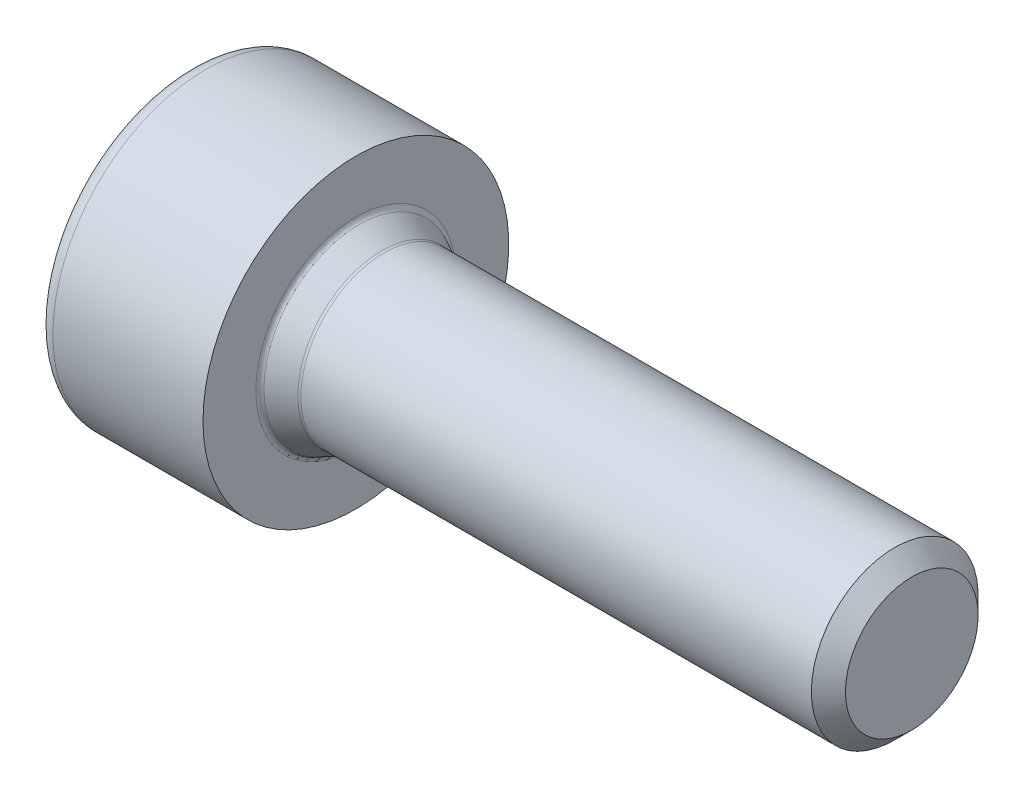
ISO-10303-21;
HEADER;
FILE_DESCRIPTION(('STEP AP214'),'2;1');
FILE_NAME('part.step','',(''),(''),'','','');
FILE_SCHEMA(('AUTOMOTIVE_DESIGN { 1 0 10303 214 1 1 1 1 }'));
ENDSEC;
DATA;
#1=APPLICATION_CONTEXT('core data for automotive mechanical design processes');
#2=APPLICATION_PROTOCOL_DEFINITION('international standard','automotive_design',2000,#1);
#3=PRODUCT_CONTEXT('',#1,'mechanical');
#4=PRODUCT('Part','Part','',(#3));
#5=PRODUCT_RELATED_PRODUCT_CATEGORY('part','',(#4));
#6=PRODUCT_DEFINITION_FORMATION('','',#4);
#7=PRODUCT_DEFINITION_CONTEXT('part definition',#1,'design');
#8=PRODUCT_DEFINITION('design','',#6,#7);
#9=PRODUCT_DEFINITION_SHAPE('','',#8);
#10=(LENGTH_UNIT() NAMED_UNIT(*) SI_UNIT(.MILLI.,.METRE.));
#11=(NAMED_UNIT(*) PLANE_ANGLE_UNIT() SI_UNIT($,.RADIAN.));
#12=(NAMED_UNIT(*) SI_UNIT($,.STERADIAN.) SOLID_ANGLE_UNIT());
#13=UNCERTAINTY_MEASURE_WITH_UNIT(LENGTH_MEASURE(1.E-05),#10,'distance_accuracy_value','');
#14=(GEOMETRIC_REPRESENTATION_CONTEXT(3) GLOBAL_UNCERTAINTY_ASSIGNED_CONTEXT((#13)) GLOBAL_UNIT_ASSIGNED_CONTEXT((#10,
#11,#12)) REPRESENTATION_CONTEXT('',''));
#15=CARTESIAN_POINT('',(0.,0.,0.));
#16=DIRECTION('',(0.,0.,1.));
#17=DIRECTION('',(1.,0.,0.));
#18=AXIS2_PLACEMENT_3D('',#15,#16,#17);
#19=CARTESIAN_POINT('',(-3.,1.25,0.));
#20=DIRECTION('',(1.,0.,0.));
#21=DIRECTION('',(0.,0.,-1.));
#22=AXIS2_PLACEMENT_3D('',#19,#20,#21);
#23=PLANE('',#22);
#24=DIRECTION('',(0.,0.5,-0.866025403784439));
#25=VECTOR('',#24,1.);
#26=CARTESIAN_POINT('',(-3.,-0.770031754730548,-1.16626587736527));
#27=LINE('',#26,#25);
#28=CARTESIAN_POINT('',(-3.,-1.44337567297406,0.));
#29=VERTEX_POINT('',#28);
#30=CARTESIAN_POINT('',(-3.,-0.721687836487032,-1.25));
#31=VERTEX_POINT('',#30);
#32=EDGE_CURVE('E250',#29,#31,#27,.T.);
#33=ORIENTED_EDGE('',*,*,#32,.T.);
#34=DIRECTION('',(0.,1.,0.));
#35=VECTOR('',#34,1.);
#36=CARTESIAN_POINT('',(-3.,1.25,-1.25));
#37=LINE('',#36,#35);
#38=CARTESIAN_POINT('',(-3.,0.721687836487032,-1.25));
#39=VERTEX_POINT('',#38);
#40=EDGE_CURVE('E52',#31,#39,#37,.T.);
#41=ORIENTED_EDGE('',*,*,#40,.T.);
#42=DIRECTION('',(0.,0.5,0.866025403784439));
#43=VECTOR('',#42,1.);
#44=CARTESIAN_POINT('',(-3.,1.39503175473055,-0.0837341226347258));
#45=LINE('',#44,#43);
#46=CARTESIAN_POINT('',(-3.,1.44337567297406,0.));
#47=VERTEX_POINT('',#46);
#48=EDGE_CURVE('E100',#39,#47,#45,.T.);
#49=ORIENTED_EDGE('',*,*,#48,.T.);
#50=DIRECTION('',(0.,-0.5,0.866025403784439));
#51=VECTOR('',#50,1.);
#52=CARTESIAN_POINT('',(-3.,1.39503175473055,0.0837341226347258));
#53=LINE('',#52,#51);
#54=CARTESIAN_POINT('',(-3.,0.721687836487032,1.25));
#55=VERTEX_POINT('',#54);
#56=EDGE_CURVE('E249',#47,#55,#53,.T.);
#57=ORIENTED_EDGE('',*,*,#56,.T.);
#58=DIRECTION('',(0.,-1.,0.));
#59=VECTOR('',#58,1.);
#60=CARTESIAN_POINT('',(-3.,1.25,1.25));
#61=LINE('',#60,#59);
#62=CARTESIAN_POINT('',(-3.,-0.721687836487032,1.25));
#63=VERTEX_POINT('',#62);
#64=EDGE_CURVE('E182',#55,#63,#61,.T.);
#65=ORIENTED_EDGE('',*,*,#64,.T.);
#66=DIRECTION('',(0.,-0.5,-0.866025403784439));
#67=VECTOR('',#66,1.);
#68=CARTESIAN_POINT('',(-3.,-0.770031754730549,1.16626587736527));
#69=LINE('',#68,#67);
#70=EDGE_CURVE('E241',#63,#29,#69,.T.);
#71=ORIENTED_EDGE('',*,*,#70,.T.);
#72=EDGE_LOOP('',(#33,#41,#49,#57,#65,#71));
#73=FACE_BOUND('',#72,.T.);
#74=CARTESIAN_POINT('',(-3.,0.,0.));
#75=DIRECTION('',(-1.,0.,0.));
#76=DIRECTION('',(0.,0.,1.));
#77=AXIS2_PLACEMENT_3D('',#74,#75,#76);
#78=CIRCLE('',#77,2.45);
#79=CARTESIAN_POINT('',(-3.,0.,2.45));
#80=VERTEX_POINT('',#79);
#81=EDGE_CURVE('E240',#80,#80,#78,.T.);
#82=ORIENTED_EDGE('',*,*,#81,.T.);
#83=EDGE_LOOP('',(#82));
#84=FACE_BOUND('',#83,.T.);
#85=ADVANCED_FACE('F90',(#73,#84),#23,.F.);
#86=CARTESIAN_POINT('',(-2.69999999999999,0.,0.));
#87=DIRECTION('',(-1.,0.,0.));
#88=DIRECTION('',(0.,0.,1.));
#89=AXIS2_PLACEMENT_3D('',#86,#87,#88);
#90=TOROIDAL_SURFACE('',#89,2.44999999999999,0.300000000000006);
#91=ORIENTED_EDGE('',*,*,#81,.F.);
#92=EDGE_LOOP('',(#91));
#93=FACE_BOUND('',#92,.T.);
#94=CARTESIAN_POINT('',(-2.7,0.,0.));
#95=DIRECTION('',(-1.,0.,0.));
#96=DIRECTION('',(0.,0.,1.));
#97=AXIS2_PLACEMENT_3D('',#94,#95,#96);
#98=CIRCLE('',#97,2.75);
#99=CARTESIAN_POINT('',(-2.7,0.,2.75));
#100=VERTEX_POINT('',#99);
#101=EDGE_CURVE('E233',#100,#100,#98,.T.);
#102=ORIENTED_EDGE('',*,*,#101,.T.);
#103=EDGE_LOOP('',(#102));
#104=FACE_BOUND('',#103,.T.);
#105=ADVANCED_FACE('F302',(#93,#104),#90,.T.);
#106=CARTESIAN_POINT('',(10.,0.,0.));
#107=DIRECTION('',(-1.,0.,0.));
#108=DIRECTION('',(0.,0.,1.));
#109=AXIS2_PLACEMENT_3D('',#106,#107,#108);
#110=CYLINDRICAL_SURFACE('',#109,2.75);
#111=ORIENTED_EDGE('',*,*,#101,.F.);
#112=EDGE_LOOP('',(#111));
#113=FACE_BOUND('',#112,.T.);
#114=CARTESIAN_POINT('',(0.,0.,0.));
#115=DIRECTION('',(-1.,0.,0.));
#116=DIRECTION('',(0.,0.,1.));
#117=AXIS2_PLACEMENT_3D('',#114,#115,#116);
#118=CIRCLE('',#117,2.75);
#119=CARTESIAN_POINT('',(0.,0.,2.75));
#120=VERTEX_POINT('',#119);
#121=EDGE_CURVE('E234',#120,#120,#118,.T.);
#122=ORIENTED_EDGE('',*,*,#121,.T.);
#123=EDGE_LOOP('',(#122));
#124=FACE_BOUND('',#123,.T.);
#125=ADVANCED_FACE('F313',(#113,#124),#110,.T.);
#126=CARTESIAN_POINT('',(0.,2.75,0.));
#127=DIRECTION('',(-1.,0.,0.));
#128=DIRECTION('',(0.,0.,1.));
#129=AXIS2_PLACEMENT_3D('',#126,#127,#128);
#130=PLANE('',#129);
#131=ORIENTED_EDGE('',*,*,#121,.F.);
#132=EDGE_LOOP('',(#131));
#133=FACE_BOUND('',#132,.T.);
#134=CARTESIAN_POINT('',(0.,0.,0.));
#135=DIRECTION('',(-1.,0.,0.));
#136=DIRECTION('',(0.,0.,1.));
#137=AXIS2_PLACEMENT_3D('',#134,#135,#136);
#138=CIRCLE('',#137,1.8);
#139=CARTESIAN_POINT('',(0.,0.,1.8));
#140=VERTEX_POINT('',#139);
#141=EDGE_CURVE('E229',#140,#140,#138,.T.);
#142=ORIENTED_EDGE('',*,*,#141,.T.);
#143=EDGE_LOOP('',(#142));
#144=FACE_BOUND('',#143,.T.);
#145=ADVANCED_FACE('F320',(#133,#144),#130,.F.);
#146=CARTESIAN_POINT('',(0.0999999999999991,0.,0.));
#147=DIRECTION('',(-1.,0.,0.));
#148=DIRECTION('',(0.,0.,1.));
#149=AXIS2_PLACEMENT_3D('',#146,#147,#148);
#150=TOROIDAL_SURFACE('',#149,1.8,0.0999999999999991);
#151=ORIENTED_EDGE('',*,*,#141,.F.);
#152=EDGE_LOOP('',(#151));
#153=FACE_BOUND('',#152,.T.);
#154=CARTESIAN_POINT('',(0.0561576367978586,0.,0.));
#155=DIRECTION('',(-1.,0.,0.));
#156=DIRECTION('',(0.,0.,1.));
#157=AXIS2_PLACEMENT_3D('',#154,#155,#156);
#158=CIRCLE('',#157,1.71012315543561);
#159=CARTESIAN_POINT('',(0.0561576367978586,0.,1.71012315543561));
#160=VERTEX_POINT('',#159);
#161=EDGE_CURVE('E223',#160,#160,#158,.T.);
#162=ORIENTED_EDGE('',*,*,#161,.T.);
#163=EDGE_LOOP('',(#162));
#164=FACE_BOUND('',#163,.T.);
#165=ADVANCED_FACE('F319',(#153,#164),#150,.F.);
#166=CARTESIAN_POINT('',(0.466157636797859,0.,0.));
#167=DIRECTION('',(-1.,0.,0.));
#168=DIRECTION('',(0.,0.,1.));
#169=AXIS2_PLACEMENT_3D('',#166,#167,#168);
#170=CONICAL_SURFACE('',#169,1.51012315543561,0.453844001521507);
#171=ORIENTED_EDGE('',*,*,#161,.F.);
#172=EDGE_LOOP('',(#171));
#173=FACE_BOUND('',#172,.T.);
#174=CARTESIAN_POINT('',(0.466157636797859,0.,0.));
#175=DIRECTION('',(-1.,0.,0.));
#176=DIRECTION('',(0.,0.,1.));
#177=AXIS2_PLACEMENT_3D('',#174,#175,#176);
#178=CIRCLE('',#177,1.51012315543561);
#179=CARTESIAN_POINT('',(0.466157636797859,0.,1.51012315543561));
#180=VERTEX_POINT('',#179);
#181=EDGE_CURVE('E225',#180,#180,#178,.T.);
#182=ORIENTED_EDGE('',*,*,#181,.T.);
#183=EDGE_LOOP('',(#182));
#184=FACE_BOUND('',#183,.T.);
#185=ADVANCED_FACE('F322',(#173,#184),#170,.T.);
#186=CARTESIAN_POINT('',(0.51000000000001,0.,0.));
#187=DIRECTION('',(-1.,0.,0.));
#188=DIRECTION('',(0.,0.,1.));
#189=AXIS2_PLACEMENT_3D('',#186,#187,#188);
#190=TOROIDAL_SURFACE('',#189,1.60000000000003,0.10000000000003);
#191=ORIENTED_EDGE('',*,*,#181,.F.);
#192=EDGE_LOOP('',(#191));
#193=FACE_BOUND('',#192,.T.);
#194=CARTESIAN_POINT('',(0.51,0.,0.));
#195=DIRECTION('',(-1.,0.,0.));
#196=DIRECTION('',(0.,0.,1.));
#197=AXIS2_PLACEMENT_3D('',#194,#195,#196);
#198=CIRCLE('',#197,1.5);
#199=CARTESIAN_POINT('',(0.51,0.,1.5));
#200=VERTEX_POINT('',#199);
#201=EDGE_CURVE('E218',#200,#200,#198,.T.);
#202=ORIENTED_EDGE('',*,*,#201,.T.);
#203=EDGE_LOOP('',(#202));
#204=FACE_BOUND('',#203,.T.);
#205=ADVANCED_FACE('F327',(#193,#204),#190,.F.);
#206=CARTESIAN_POINT('',(10.,0.,0.));
#207=DIRECTION('',(-1.,0.,0.));
#208=DIRECTION('',(0.,0.,1.));
#209=AXIS2_PLACEMENT_3D('',#206,#207,#208);
#210=CYLINDRICAL_SURFACE('',#209,1.5);
#211=ORIENTED_EDGE('',*,*,#201,.F.);
#212=EDGE_LOOP('',(#211));
#213=FACE_BOUND('',#212,.T.);
#214=CARTESIAN_POINT('',(9.6935,0.,0.));
#215=DIRECTION('',(-1.,0.,0.));
#216=DIRECTION('',(0.,0.,1.));
#217=AXIS2_PLACEMENT_3D('',#214,#215,#216);
#218=CIRCLE('',#217,1.5);
#219=CARTESIAN_POINT('',(9.6935,0.,1.5));
#220=VERTEX_POINT('',#219);
#221=EDGE_CURVE('E216',#220,#220,#218,.T.);
#222=ORIENTED_EDGE('',*,*,#221,.T.);
#223=EDGE_LOOP('',(#222));
#224=FACE_BOUND('',#223,.T.);
#225=ADVANCED_FACE('F332',(#213,#224),#210,.T.);
#226=CARTESIAN_POINT('',(10.,0.,0.));
#227=DIRECTION('',(-1.,0.,0.));
#228=DIRECTION('',(0.,0.,1.));
#229=AXIS2_PLACEMENT_3D('',#226,#227,#228);
#230=CONICAL_SURFACE('',#229,1.1935,0.785398163397449);
#231=ORIENTED_EDGE('',*,*,#221,.F.);
#232=EDGE_LOOP('',(#231));
#233=FACE_BOUND('',#232,.T.);
#234=CARTESIAN_POINT('',(10.,0.,0.));
#235=DIRECTION('',(-1.,0.,0.));
#236=DIRECTION('',(0.,0.,1.));
#237=AXIS2_PLACEMENT_3D('',#234,#235,#236);
#238=CIRCLE('',#237,1.1935);
#239=CARTESIAN_POINT('',(10.,0.,1.1935));
#240=VERTEX_POINT('',#239);
#241=EDGE_CURVE('E206',#240,#240,#238,.T.);
#242=ORIENTED_EDGE('',*,*,#241,.T.);
#243=EDGE_LOOP('',(#242));
#244=FACE_BOUND('',#243,.T.);
#245=ADVANCED_FACE('F299',(#233,#244),#230,.T.);
#246=CARTESIAN_POINT('',(10.,1.1935,0.));
#247=DIRECTION('',(-1.,0.,0.));
#248=DIRECTION('',(0.,0.,1.));
#249=AXIS2_PLACEMENT_3D('',#246,#247,#248);
#250=PLANE('',#249);
#251=ORIENTED_EDGE('',*,*,#241,.F.);
#252=EDGE_LOOP('',(#251));
#253=FACE_BOUND('',#252,.T.);
#254=ADVANCED_FACE('F295',(#253),#250,.F.);
#255=CARTESIAN_POINT('',(-1.15,0.,0.));
#256=DIRECTION('',(1.,0.,0.));
#257=DIRECTION('',(0.,0.,-1.));
#258=AXIS2_PLACEMENT_3D('',#255,#256,#257);
#259=PLANE('',#258);
#260=DIRECTION('',(0.,1.,0.));
#261=VECTOR('',#260,1.);
#262=CARTESIAN_POINT('',(-1.15,-0.721687836487032,-1.25));
#263=LINE('',#262,#261);
#264=CARTESIAN_POINT('',(-1.15,-0.721687836487032,-1.25));
#265=VERTEX_POINT('',#264);
#266=CARTESIAN_POINT('',(-1.15,0.,-1.25));
#267=VERTEX_POINT('',#266);
#268=EDGE_CURVE('E102',#265,#267,#263,.T.);
#269=ORIENTED_EDGE('',*,*,#268,.F.);
#270=DIRECTION('',(0.,0.5,-0.866025403784439));
#271=VECTOR('',#270,1.);
#272=CARTESIAN_POINT('',(-1.15,-1.44337567297406,0.));
#273=LINE('',#272,#271);
#274=CARTESIAN_POINT('',(-1.15,-1.08253175473055,-0.625));
#275=VERTEX_POINT('',#274);
#276=EDGE_CURVE('E192',#275,#265,#273,.T.);
#277=ORIENTED_EDGE('',*,*,#276,.F.);
#278=CARTESIAN_POINT('',(-1.15,0.,0.));
#279=DIRECTION('',(-1.,0.,0.));
#280=DIRECTION('',(0.,0.,1.));
#281=AXIS2_PLACEMENT_3D('',#278,#279,#280);
#282=CIRCLE('',#281,1.25);
#283=EDGE_CURVE('E269',#267,#275,#282,.T.);
#284=ORIENTED_EDGE('',*,*,#283,.F.);
#285=EDGE_LOOP('',(#269,#277,#284));
#286=FACE_BOUND('',#285,.T.);
#287=ADVANCED_FACE('F287',(#286),#259,.F.);
#288=CARTESIAN_POINT('',(-1.15,-1.44337567297406,0.));
#289=VERTEX_POINT('',#288);
#290=EDGE_CURVE('E198',#289,#275,#273,.T.);
#291=ORIENTED_EDGE('',*,*,#290,.F.);
#292=DIRECTION('',(0.,-0.5,-0.866025403784439));
#293=VECTOR('',#292,1.);
#294=CARTESIAN_POINT('',(-1.15,-0.721687836487032,1.25));
#295=LINE('',#294,#293);
#296=CARTESIAN_POINT('',(-1.15,-1.08253175473055,0.625));
#297=VERTEX_POINT('',#296);
#298=EDGE_CURVE('E190',#297,#289,#295,.T.);
#299=ORIENTED_EDGE('',*,*,#298,.F.);
#300=EDGE_CURVE('E271',#275,#297,#282,.T.);
#301=ORIENTED_EDGE('',*,*,#300,.F.);
#302=EDGE_LOOP('',(#291,#299,#301));
#303=FACE_BOUND('',#302,.T.);
#304=ADVANCED_FACE('F276',(#303),#259,.F.);
#305=CARTESIAN_POINT('',(-1.15,-0.721687836487032,1.25));
#306=VERTEX_POINT('',#305);
#307=EDGE_CURVE('E194',#306,#297,#295,.T.);
#308=ORIENTED_EDGE('',*,*,#307,.F.);
#309=DIRECTION('',(0.,-1.,0.));
#310=VECTOR('',#309,1.);
#311=CARTESIAN_POINT('',(-1.15,0.721687836487032,1.25));
#312=LINE('',#311,#310);
#313=CARTESIAN_POINT('',(-1.15,0.,1.25));
#314=VERTEX_POINT('',#313);
#315=EDGE_CURVE('E189',#314,#306,#312,.T.);
#316=ORIENTED_EDGE('',*,*,#315,.F.);
#317=EDGE_CURVE('E238',#297,#314,#282,.T.);
#318=ORIENTED_EDGE('',*,*,#317,.F.);
#319=EDGE_LOOP('',(#308,#316,#318));
#320=FACE_BOUND('',#319,.T.);
#321=ADVANCED_FACE('F277',(#320),#259,.F.);
#322=CARTESIAN_POINT('',(-1.15,0.721687836487032,1.25));
#323=VERTEX_POINT('',#322);
#324=EDGE_CURVE('E180',#323,#314,#312,.T.);
#325=ORIENTED_EDGE('',*,*,#324,.F.);
#326=DIRECTION('',(0.,-0.5,0.866025403784439));
#327=VECTOR('',#326,1.);
#328=CARTESIAN_POINT('',(-1.15,1.44337567297406,0.));
#329=LINE('',#328,#327);
#330=CARTESIAN_POINT('',(-1.15,1.08253175473055,0.625));
#331=VERTEX_POINT('',#330);
#332=EDGE_CURVE('E164',#331,#323,#329,.T.);
#333=ORIENTED_EDGE('',*,*,#332,.F.);
#334=EDGE_CURVE('E183',#314,#331,#282,.T.);
#335=ORIENTED_EDGE('',*,*,#334,.F.);
#336=EDGE_LOOP('',(#325,#333,#335));
#337=FACE_BOUND('',#336,.T.);
#338=ADVANCED_FACE('F184',(#337),#259,.F.);
#339=CARTESIAN_POINT('',(-1.15,1.44337567297406,0.));
#340=VERTEX_POINT('',#339);
#341=EDGE_CURVE('E172',#340,#331,#329,.T.);
#342=ORIENTED_EDGE('',*,*,#341,.F.);
#343=DIRECTION('',(0.,0.5,0.866025403784439));
#344=VECTOR('',#343,1.);
#345=CARTESIAN_POINT('',(-1.15,0.721687836487032,-1.25));
#346=LINE('',#345,#344);
#347=CARTESIAN_POINT('',(-1.15,1.08253175473055,-0.625));
#348=VERTEX_POINT('',#347);
#349=EDGE_CURVE('E203',#348,#340,#346,.T.);
#350=ORIENTED_EDGE('',*,*,#349,.F.);
#351=EDGE_CURVE('E245',#331,#348,#282,.T.);
#352=ORIENTED_EDGE('',*,*,#351,.F.);
#353=EDGE_LOOP('',(#342,#350,#352));
#354=FACE_BOUND('',#353,.T.);
#355=ADVANCED_FACE('F305',(#354),#259,.F.);
#356=CARTESIAN_POINT('',(-1.15,0.721687836487032,-1.25));
#357=VERTEX_POINT('',#356);
#358=EDGE_CURVE('E185',#357,#348,#346,.T.);
#359=ORIENTED_EDGE('',*,*,#358,.F.);
#360=EDGE_CURVE('E200',#267,#357,#263,.T.);
#361=ORIENTED_EDGE('',*,*,#360,.F.);
#362=EDGE_CURVE('E262',#348,#267,#282,.T.);
#363=ORIENTED_EDGE('',*,*,#362,.F.);
#364=EDGE_LOOP('',(#359,#361,#363));
#365=FACE_BOUND('',#364,.T.);
#366=ADVANCED_FACE('F265',(#365),#259,.F.);
#367=CARTESIAN_POINT('',(-3.75,1.44337567297406,0.));
#368=DIRECTION('',(0.,0.866025403784439,0.5));
#369=DIRECTION('',(0.,-0.5,0.866025403784439));
#370=AXIS2_PLACEMENT_3D('',#367,#368,#369);
#371=PLANE('',#370);
#372=ORIENTED_EDGE('',*,*,#56,.F.);
#373=DIRECTION('',(1.,0.,0.));
#374=VECTOR('',#373,1.);
#375=CARTESIAN_POINT('',(-3.75,1.44337567297406,0.));
#376=LINE('',#375,#374);
#377=EDGE_CURVE('E204',#47,#340,#376,.T.);
#378=ORIENTED_EDGE('',*,*,#377,.T.);
#379=ORIENTED_EDGE('',*,*,#341,.T.);
#380=ORIENTED_EDGE('',*,*,#332,.T.);
#381=DIRECTION('',(1.,0.,0.));
#382=VECTOR('',#381,1.);
#383=CARTESIAN_POINT('',(-3.75,0.721687836487032,1.25));
#384=LINE('',#383,#382);
#385=EDGE_CURVE('E169',#55,#323,#384,.T.);
#386=ORIENTED_EDGE('',*,*,#385,.F.);
#387=EDGE_LOOP('',(#372,#378,#379,#380,#386));
#388=FACE_BOUND('',#387,.T.);
#389=ADVANCED_FACE('F170',(#388),#371,.F.);
#390=CARTESIAN_POINT('',(-3.75,0.721687836487032,-1.25));
#391=DIRECTION('',(0.,0.866025403784439,-0.5));
#392=DIRECTION('',(0.,0.5,0.866025403784439));
#393=AXIS2_PLACEMENT_3D('',#390,#391,#392);
#394=PLANE('',#393);
#395=ORIENTED_EDGE('',*,*,#48,.F.);
#396=DIRECTION('',(1.,0.,0.));
#397=VECTOR('',#396,1.);
#398=CARTESIAN_POINT('',(-3.75,0.721687836487032,-1.25));
#399=LINE('',#398,#397);
#400=EDGE_CURVE('E210',#39,#357,#399,.T.);
#401=ORIENTED_EDGE('',*,*,#400,.T.);
#402=ORIENTED_EDGE('',*,*,#358,.T.);
#403=ORIENTED_EDGE('',*,*,#349,.T.);
#404=ORIENTED_EDGE('',*,*,#377,.F.);
#405=EDGE_LOOP('',(#395,#401,#402,#403,#404));
#406=FACE_BOUND('',#405,.T.);
#407=ADVANCED_FACE('F258',(#406),#394,.F.);
#408=CARTESIAN_POINT('',(-3.75,-0.721687836487032,-1.25));
#409=DIRECTION('',(0.,0.,-1.));
#410=DIRECTION('',(-1.,0.,0.));
#411=AXIS2_PLACEMENT_3D('',#408,#409,#410);
#412=PLANE('',#411);
#413=ORIENTED_EDGE('',*,*,#40,.F.);
#414=DIRECTION('',(1.,0.,0.));
#415=VECTOR('',#414,1.);
#416=CARTESIAN_POINT('',(-3.75,-0.721687836487032,-1.25));
#417=LINE('',#416,#415);
#418=EDGE_CURVE('E207',#31,#265,#417,.T.);
#419=ORIENTED_EDGE('',*,*,#418,.T.);
#420=ORIENTED_EDGE('',*,*,#268,.T.);
#421=ORIENTED_EDGE('',*,*,#360,.T.);
#422=ORIENTED_EDGE('',*,*,#400,.F.);
#423=EDGE_LOOP('',(#413,#419,#420,#421,#422));
#424=FACE_BOUND('',#423,.T.);
#425=ADVANCED_FACE('F256',(#424),#412,.F.);
#426=CARTESIAN_POINT('',(-3.75,-1.44337567297406,0.));
#427=DIRECTION('',(0.,-0.866025403784439,-0.5));
#428=DIRECTION('',(0.,0.5,-0.866025403784439));
#429=AXIS2_PLACEMENT_3D('',#426,#427,#428);
#430=PLANE('',#429);
#431=ORIENTED_EDGE('',*,*,#32,.F.);
#432=DIRECTION('',(1.,0.,0.));
#433=VECTOR('',#432,1.);
#434=CARTESIAN_POINT('',(-3.75,-1.44337567297406,0.));
#435=LINE('',#434,#433);
#436=EDGE_CURVE('E211',#29,#289,#435,.T.);
#437=ORIENTED_EDGE('',*,*,#436,.T.);
#438=ORIENTED_EDGE('',*,*,#290,.T.);
#439=ORIENTED_EDGE('',*,*,#276,.T.);
#440=ORIENTED_EDGE('',*,*,#418,.F.);
#441=EDGE_LOOP('',(#431,#437,#438,#439,#440));
#442=FACE_BOUND('',#441,.T.);
#443=ADVANCED_FACE('F286',(#442),#430,.F.);
#444=CARTESIAN_POINT('',(-3.75,-0.721687836487032,1.25));
#445=DIRECTION('',(0.,-0.866025403784439,0.5));
#446=DIRECTION('',(0.,-0.5,-0.866025403784439));
#447=AXIS2_PLACEMENT_3D('',#444,#445,#446);
#448=PLANE('',#447);
#449=ORIENTED_EDGE('',*,*,#70,.F.);
#450=DIRECTION('',(1.,0.,0.));
#451=VECTOR('',#450,1.);
#452=CARTESIAN_POINT('',(-3.75,-0.721687836487032,1.25));
#453=LINE('',#452,#451);
#454=EDGE_CURVE('E115',#63,#306,#453,.T.);
#455=ORIENTED_EDGE('',*,*,#454,.T.);
#456=ORIENTED_EDGE('',*,*,#307,.T.);
#457=ORIENTED_EDGE('',*,*,#298,.T.);
#458=ORIENTED_EDGE('',*,*,#436,.F.);
#459=EDGE_LOOP('',(#449,#455,#456,#457,#458));
#460=FACE_BOUND('',#459,.T.);
#461=ADVANCED_FACE('F284',(#460),#448,.F.);
#462=CARTESIAN_POINT('',(-3.75,0.721687836487032,1.25));
#463=DIRECTION('',(0.,0.,1.));
#464=DIRECTION('',(1.,0.,0.));
#465=AXIS2_PLACEMENT_3D('',#462,#463,#464);
#466=PLANE('',#465);
#467=ORIENTED_EDGE('',*,*,#64,.F.);
#468=ORIENTED_EDGE('',*,*,#385,.T.);
#469=ORIENTED_EDGE('',*,*,#324,.T.);
#470=ORIENTED_EDGE('',*,*,#315,.T.);
#471=ORIENTED_EDGE('',*,*,#454,.F.);
#472=EDGE_LOOP('',(#467,#468,#469,#470,#471));
#473=FACE_BOUND('',#472,.T.);
#474=ADVANCED_FACE('F176',(#473),#466,.F.);
#475=CARTESIAN_POINT('',(-1.15,0.,0.));
#476=DIRECTION('',(-1.,0.,0.));
#477=DIRECTION('',(0.,0.,1.));
#478=AXIS2_PLACEMENT_3D('',#475,#476,#477);
#479=CONICAL_SURFACE('',#478,1.25,1.0471975511966);
#480=CARTESIAN_POINT('',(-0.428312163512966,0.,0.));
#481=VERTEX_POINT('',#480);
#482=VERTEX_LOOP('',#481);
#483=FACE_BOUND('',#482,.T.);
#484=ORIENTED_EDGE('',*,*,#334,.T.);
#485=ORIENTED_EDGE('',*,*,#351,.T.);
#486=ORIENTED_EDGE('',*,*,#362,.T.);
#487=ORIENTED_EDGE('',*,*,#283,.T.);
#488=ORIENTED_EDGE('',*,*,#300,.T.);
#489=ORIENTED_EDGE('',*,*,#317,.T.);
#490=EDGE_LOOP('',(#484,#485,#486,#487,#488,#489));
#491=FACE_BOUND('',#490,.T.);
#492=ADVANCED_FACE('F93',(#483,#491),#479,.F.);
#493=CLOSED_SHELL('',(#85,#105,#125,#145,#165,#185,#205,#225,#245,#254,#287,#304,#321,#338,#355,
#366,#389,#407,#425,#443,#461,#474,#492));
#494=MANIFOLD_SOLID_BREP('B6',#493);
#495=ADVANCED_BREP_SHAPE_REPRESENTATION('',(#18,#494),#14);
#496=SHAPE_DEFINITION_REPRESENTATION(#9,#495);
ENDSEC;
END-ISO-10303-21;
